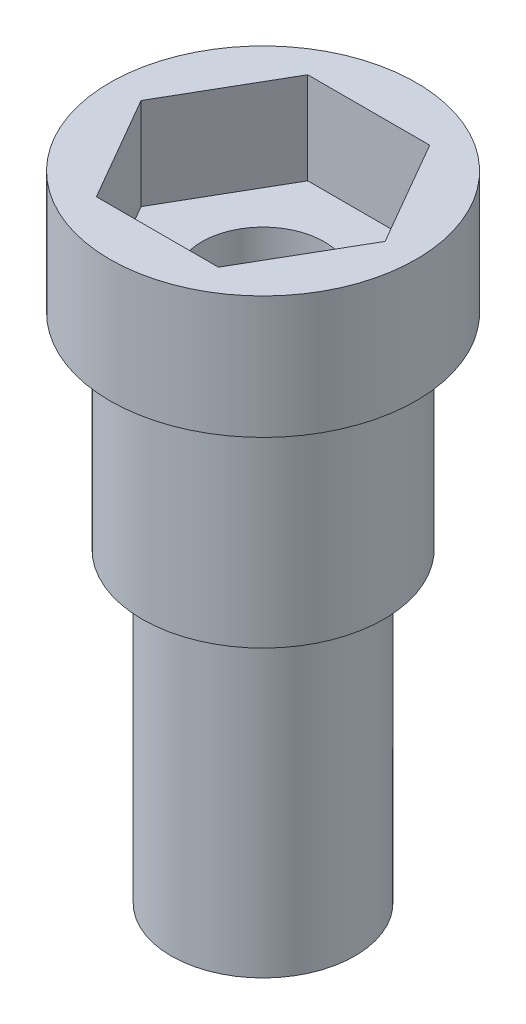
ISO-10303-21;
HEADER;
FILE_DESCRIPTION(('STEP AP214'),'2;1');
FILE_NAME('part.step','',(''),(''),'','','');
FILE_SCHEMA(('AUTOMOTIVE_DESIGN { 1 0 10303 214 1 1 1 1 }'));
ENDSEC;
DATA;
#1=APPLICATION_CONTEXT('core data for automotive mechanical design processes');
#2=APPLICATION_PROTOCOL_DEFINITION('international standard','automotive_design',2000,#1);
#3=PRODUCT_CONTEXT('',#1,'mechanical');
#4=PRODUCT('Part','Part','',(#3));
#5=PRODUCT_RELATED_PRODUCT_CATEGORY('part','',(#4));
#6=PRODUCT_DEFINITION_FORMATION('','',#4);
#7=PRODUCT_DEFINITION_CONTEXT('part definition',#1,'design');
#8=PRODUCT_DEFINITION('design','',#6,#7);
#9=PRODUCT_DEFINITION_SHAPE('','',#8);
#10=(LENGTH_UNIT() NAMED_UNIT(*) SI_UNIT(.MILLI.,.METRE.));
#11=(NAMED_UNIT(*) PLANE_ANGLE_UNIT() SI_UNIT($,.RADIAN.));
#12=(NAMED_UNIT(*) SI_UNIT($,.STERADIAN.) SOLID_ANGLE_UNIT());
#13=UNCERTAINTY_MEASURE_WITH_UNIT(LENGTH_MEASURE(1.E-05),#10,'distance_accuracy_value','');
#14=(GEOMETRIC_REPRESENTATION_CONTEXT(3) GLOBAL_UNCERTAINTY_ASSIGNED_CONTEXT((#13)) GLOBAL_UNIT_ASSIGNED_CONTEXT((#10,
#11,#12)) REPRESENTATION_CONTEXT('',''));
#15=CARTESIAN_POINT('',(0.,0.,0.));
#16=DIRECTION('',(0.,0.,1.));
#17=DIRECTION('',(1.,0.,0.));
#18=AXIS2_PLACEMENT_3D('',#15,#16,#17);
#19=CARTESIAN_POINT('',(0.,18.,0.));
#20=DIRECTION('',(0.,-1.,0.));
#21=DIRECTION('',(0.,0.,-1.));
#22=AXIS2_PLACEMENT_3D('',#19,#20,#21);
#23=CYLINDRICAL_SURFACE('',#22,2.);
#24=CARTESIAN_POINT('',(0.,0.,0.));
#25=DIRECTION('',(0.,1.,0.));
#26=DIRECTION('',(0.,0.,1.));
#27=AXIS2_PLACEMENT_3D('',#24,#25,#26);
#28=CIRCLE('',#27,2.);
#29=CARTESIAN_POINT('',(0.,0.,2.));
#30=VERTEX_POINT('',#29);
#31=EDGE_CURVE('E160',#30,#30,#28,.T.);
#32=ORIENTED_EDGE('',*,*,#31,.F.);
#33=EDGE_LOOP('',(#32));
#34=FACE_BOUND('',#33,.T.);
#35=CARTESIAN_POINT('',(0.,17.7,0.));
#36=DIRECTION('',(0.,1.,0.));
#37=DIRECTION('',(0.,0.,1.));
#38=AXIS2_PLACEMENT_3D('',#35,#36,#37);
#39=CIRCLE('',#38,2.);
#40=CARTESIAN_POINT('',(0.,17.7,2.));
#41=VERTEX_POINT('',#40);
#42=EDGE_CURVE('E45',#41,#41,#39,.T.);
#43=ORIENTED_EDGE('',*,*,#42,.T.);
#44=EDGE_LOOP('',(#43));
#45=FACE_BOUND('',#44,.T.);
#46=ADVANCED_FACE('F41',(#34,#45),#23,.F.);
#47=CARTESIAN_POINT('',(0.,18.,0.));
#48=DIRECTION('',(0.,-1.,0.));
#49=DIRECTION('',(0.,0.,-1.));
#50=AXIS2_PLACEMENT_3D('',#47,#48,#49);
#51=CYLINDRICAL_SURFACE('',#50,3.);
#52=CARTESIAN_POINT('',(0.,0.,0.));
#53=DIRECTION('',(0.,1.,0.));
#54=DIRECTION('',(0.,0.,1.));
#55=AXIS2_PLACEMENT_3D('',#52,#53,#54);
#56=CIRCLE('',#55,3.);
#57=CARTESIAN_POINT('',(0.,0.,3.));
#58=VERTEX_POINT('',#57);
#59=EDGE_CURVE('E50',#58,#58,#56,.T.);
#60=ORIENTED_EDGE('',*,*,#59,.T.);
#61=EDGE_LOOP('',(#60));
#62=FACE_BOUND('',#61,.T.);
#63=CARTESIAN_POINT('',(0.,10.,0.));
#64=DIRECTION('',(0.,1.,0.));
#65=DIRECTION('',(0.,0.,1.));
#66=AXIS2_PLACEMENT_3D('',#63,#64,#65);
#67=CIRCLE('',#66,3.);
#68=CARTESIAN_POINT('',(0.,10.,3.));
#69=VERTEX_POINT('',#68);
#70=EDGE_CURVE('E11',#69,#69,#67,.T.);
#71=ORIENTED_EDGE('',*,*,#70,.F.);
#72=EDGE_LOOP('',(#71));
#73=FACE_BOUND('',#72,.T.);
#74=ADVANCED_FACE('F43',(#62,#73),#51,.T.);
#75=CARTESIAN_POINT('',(0.,0.,0.));
#76=DIRECTION('',(0.,1.,0.));
#77=DIRECTION('',(0.,0.,1.));
#78=AXIS2_PLACEMENT_3D('',#75,#76,#77);
#79=PLANE('',#78);
#80=ORIENTED_EDGE('',*,*,#59,.F.);
#81=EDGE_LOOP('',(#80));
#82=FACE_BOUND('',#81,.T.);
#83=ORIENTED_EDGE('',*,*,#31,.T.);
#84=EDGE_LOOP('',(#83));
#85=FACE_BOUND('',#84,.T.);
#86=ADVANCED_FACE('F169',(#82,#85),#79,.F.);
#87=CARTESIAN_POINT('',(0.,10.,0.));
#88=DIRECTION('',(0.,1.,0.));
#89=DIRECTION('',(0.,0.,1.));
#90=AXIS2_PLACEMENT_3D('',#87,#88,#89);
#91=PLANE('',#90);
#92=CARTESIAN_POINT('',(0.,10.,0.));
#93=DIRECTION('',(0.,1.,0.));
#94=DIRECTION('',(0.,0.,1.));
#95=AXIS2_PLACEMENT_3D('',#92,#93,#94);
#96=CIRCLE('',#95,3.95);
#97=CARTESIAN_POINT('',(0.,10.,3.95));
#98=VERTEX_POINT('',#97);
#99=EDGE_CURVE('E153',#98,#98,#96,.T.);
#100=ORIENTED_EDGE('',*,*,#99,.F.);
#101=EDGE_LOOP('',(#100));
#102=FACE_BOUND('',#101,.T.);
#103=ORIENTED_EDGE('',*,*,#70,.T.);
#104=EDGE_LOOP('',(#103));
#105=FACE_BOUND('',#104,.T.);
#106=ADVANCED_FACE('F172',(#102,#105),#91,.F.);
#107=CARTESIAN_POINT('',(0.,16.7,0.));
#108=DIRECTION('',(0.,-1.,0.));
#109=DIRECTION('',(0.,0.,-1.));
#110=AXIS2_PLACEMENT_3D('',#107,#108,#109);
#111=CYLINDRICAL_SURFACE('',#110,3.95);
#112=CARTESIAN_POINT('',(0.,16.7,0.));
#113=DIRECTION('',(0.,1.,0.));
#114=DIRECTION('',(0.,0.,1.));
#115=AXIS2_PLACEMENT_3D('',#112,#113,#114);
#116=CIRCLE('',#115,3.95);
#117=CARTESIAN_POINT('',(0.,16.7,3.95));
#118=VERTEX_POINT('',#117);
#119=EDGE_CURVE('E157',#118,#118,#116,.T.);
#120=ORIENTED_EDGE('',*,*,#119,.F.);
#121=EDGE_LOOP('',(#120));
#122=FACE_BOUND('',#121,.T.);
#123=ORIENTED_EDGE('',*,*,#99,.T.);
#124=EDGE_LOOP('',(#123));
#125=FACE_BOUND('',#124,.T.);
#126=ADVANCED_FACE('F209',(#122,#125),#111,.T.);
#127=CARTESIAN_POINT('',(0.,20.7,0.));
#128=DIRECTION('',(0.,1.,0.));
#129=DIRECTION('',(0.,0.,1.));
#130=AXIS2_PLACEMENT_3D('',#127,#128,#129);
#131=PLANE('',#130);
#132=DIRECTION('',(0.5,0.,-0.866025403784439));
#133=VECTOR('',#132,1.);
#134=CARTESIAN_POINT('',(1.99185842870421,20.7,3.45));
#135=LINE('',#134,#133);
#136=CARTESIAN_POINT('',(1.99185842870421,20.7,3.45));
#137=VERTEX_POINT('',#136);
#138=CARTESIAN_POINT('',(3.98371685740842,20.7,0.));
#139=VERTEX_POINT('',#138);
#140=EDGE_CURVE('E58',#137,#139,#135,.T.);
#141=ORIENTED_EDGE('',*,*,#140,.F.);
#142=DIRECTION('',(1.,0.,0.));
#143=VECTOR('',#142,1.);
#144=CARTESIAN_POINT('',(-1.99185842870421,20.7,3.45));
#145=LINE('',#144,#143);
#146=CARTESIAN_POINT('',(-1.99185842870421,20.7,3.45));
#147=VERTEX_POINT('',#146);
#148=EDGE_CURVE('E141',#147,#137,#145,.T.);
#149=ORIENTED_EDGE('',*,*,#148,.F.);
#150=DIRECTION('',(0.5,0.,0.866025403784439));
#151=VECTOR('',#150,1.);
#152=CARTESIAN_POINT('',(-3.98371685740842,20.7,0.));
#153=LINE('',#152,#151);
#154=CARTESIAN_POINT('',(-3.98371685740842,20.7,0.));
#155=VERTEX_POINT('',#154);
#156=EDGE_CURVE('E139',#155,#147,#153,.T.);
#157=ORIENTED_EDGE('',*,*,#156,.F.);
#158=DIRECTION('',(-0.5,0.,0.866025403784439));
#159=VECTOR('',#158,1.);
#160=CARTESIAN_POINT('',(-1.99185842870421,20.7,-3.45));
#161=LINE('',#160,#159);
#162=CARTESIAN_POINT('',(-1.99185842870421,20.7,-3.45));
#163=VERTEX_POINT('',#162);
#164=EDGE_CURVE('E106',#163,#155,#161,.T.);
#165=ORIENTED_EDGE('',*,*,#164,.F.);
#166=DIRECTION('',(-1.,0.,0.));
#167=VECTOR('',#166,1.);
#168=CARTESIAN_POINT('',(1.99185842870421,20.7,-3.45));
#169=LINE('',#168,#167);
#170=CARTESIAN_POINT('',(1.99185842870421,20.7,-3.45));
#171=VERTEX_POINT('',#170);
#172=EDGE_CURVE('E135',#171,#163,#169,.T.);
#173=ORIENTED_EDGE('',*,*,#172,.F.);
#174=DIRECTION('',(-0.5,0.,-0.866025403784439));
#175=VECTOR('',#174,1.);
#176=CARTESIAN_POINT('',(3.98371685740842,20.7,0.));
#177=LINE('',#176,#175);
#178=EDGE_CURVE('E132',#139,#171,#177,.T.);
#179=ORIENTED_EDGE('',*,*,#178,.F.);
#180=EDGE_LOOP('',(#141,#149,#157,#165,#173,#179));
#181=FACE_BOUND('',#180,.T.);
#182=CARTESIAN_POINT('',(0.,20.7,0.));
#183=DIRECTION('',(0.,1.,0.));
#184=DIRECTION('',(0.,0.,1.));
#185=AXIS2_PLACEMENT_3D('',#182,#183,#184);
#186=CIRCLE('',#185,5.);
#187=CARTESIAN_POINT('',(0.,20.7,5.));
#188=VERTEX_POINT('',#187);
#189=EDGE_CURVE('E150',#188,#188,#186,.T.);
#190=ORIENTED_EDGE('',*,*,#189,.T.);
#191=EDGE_LOOP('',(#190));
#192=FACE_BOUND('',#191,.T.);
#193=ADVANCED_FACE('F205',(#181,#192),#131,.T.);
#194=CARTESIAN_POINT('',(0.,16.7,0.));
#195=DIRECTION('',(0.,1.,0.));
#196=DIRECTION('',(0.,0.,1.));
#197=AXIS2_PLACEMENT_3D('',#194,#195,#196);
#198=PLANE('',#197);
#199=ORIENTED_EDGE('',*,*,#119,.T.);
#200=EDGE_LOOP('',(#199));
#201=FACE_BOUND('',#200,.T.);
#202=CARTESIAN_POINT('',(0.,16.7,0.));
#203=DIRECTION('',(0.,1.,0.));
#204=DIRECTION('',(0.,0.,1.));
#205=AXIS2_PLACEMENT_3D('',#202,#203,#204);
#206=CIRCLE('',#205,5.);
#207=CARTESIAN_POINT('',(0.,16.7,5.));
#208=VERTEX_POINT('',#207);
#209=EDGE_CURVE('E154',#208,#208,#206,.T.);
#210=ORIENTED_EDGE('',*,*,#209,.F.);
#211=EDGE_LOOP('',(#210));
#212=FACE_BOUND('',#211,.T.);
#213=ADVANCED_FACE('F208',(#201,#212),#198,.F.);
#214=CARTESIAN_POINT('',(0.,20.7,0.));
#215=DIRECTION('',(0.,-1.,0.));
#216=DIRECTION('',(0.,0.,-1.));
#217=AXIS2_PLACEMENT_3D('',#214,#215,#216);
#218=CYLINDRICAL_SURFACE('',#217,5.);
#219=ORIENTED_EDGE('',*,*,#189,.F.);
#220=EDGE_LOOP('',(#219));
#221=FACE_BOUND('',#220,.T.);
#222=ORIENTED_EDGE('',*,*,#209,.T.);
#223=EDGE_LOOP('',(#222));
#224=FACE_BOUND('',#223,.T.);
#225=ADVANCED_FACE('F204',(#221,#224),#218,.T.);
#226=CARTESIAN_POINT('',(1.99185842870421,17.7,3.45));
#227=DIRECTION('',(0.866025403784439,0.,0.5));
#228=DIRECTION('',(0.5,0.,-0.866025403784439));
#229=AXIS2_PLACEMENT_3D('',#226,#227,#228);
#230=PLANE('',#229);
#231=ORIENTED_EDGE('',*,*,#140,.T.);
#232=DIRECTION('',(0.,1.,0.));
#233=VECTOR('',#232,1.);
#234=CARTESIAN_POINT('',(3.98371685740842,17.7,0.));
#235=LINE('',#234,#233);
#236=CARTESIAN_POINT('',(3.98371685740842,17.7,0.));
#237=VERTEX_POINT('',#236);
#238=EDGE_CURVE('E88',#237,#139,#235,.T.);
#239=ORIENTED_EDGE('',*,*,#238,.F.);
#240=DIRECTION('',(0.5,0.,-0.866025403784439));
#241=VECTOR('',#240,1.);
#242=CARTESIAN_POINT('',(1.99185842870421,17.7,3.45));
#243=LINE('',#242,#241);
#244=CARTESIAN_POINT('',(1.99185842870421,17.7,3.45));
#245=VERTEX_POINT('',#244);
#246=EDGE_CURVE('E143',#245,#237,#243,.T.);
#247=ORIENTED_EDGE('',*,*,#246,.F.);
#248=DIRECTION('',(0.,1.,0.));
#249=VECTOR('',#248,1.);
#250=CARTESIAN_POINT('',(1.99185842870421,17.7,3.45));
#251=LINE('',#250,#249);
#252=EDGE_CURVE('E66',#245,#137,#251,.T.);
#253=ORIENTED_EDGE('',*,*,#252,.T.);
#254=EDGE_LOOP('',(#231,#239,#247,#253));
#255=FACE_BOUND('',#254,.T.);
#256=ADVANCED_FACE('F194',(#255),#230,.F.);
#257=CARTESIAN_POINT('',(-1.99185842870421,17.7,3.45));
#258=DIRECTION('',(0.,0.,1.));
#259=DIRECTION('',(1.,0.,0.));
#260=AXIS2_PLACEMENT_3D('',#257,#258,#259);
#261=PLANE('',#260);
#262=ORIENTED_EDGE('',*,*,#148,.T.);
#263=ORIENTED_EDGE('',*,*,#252,.F.);
#264=DIRECTION('',(1.,0.,0.));
#265=VECTOR('',#264,1.);
#266=CARTESIAN_POINT('',(-1.99185842870421,17.7,3.45));
#267=LINE('',#266,#265);
#268=CARTESIAN_POINT('',(-1.99185842870421,17.7,3.45));
#269=VERTEX_POINT('',#268);
#270=EDGE_CURVE('E118',#269,#245,#267,.T.);
#271=ORIENTED_EDGE('',*,*,#270,.F.);
#272=DIRECTION('',(0.,1.,0.));
#273=VECTOR('',#272,1.);
#274=CARTESIAN_POINT('',(-1.99185842870421,17.7,3.45));
#275=LINE('',#274,#273);
#276=EDGE_CURVE('E110',#269,#147,#275,.T.);
#277=ORIENTED_EDGE('',*,*,#276,.T.);
#278=EDGE_LOOP('',(#262,#263,#271,#277));
#279=FACE_BOUND('',#278,.T.);
#280=ADVANCED_FACE('F191',(#279),#261,.F.);
#281=CARTESIAN_POINT('',(-3.98371685740842,17.7,0.));
#282=DIRECTION('',(-0.866025403784439,0.,0.5));
#283=DIRECTION('',(0.5,0.,0.866025403784439));
#284=AXIS2_PLACEMENT_3D('',#281,#282,#283);
#285=PLANE('',#284);
#286=ORIENTED_EDGE('',*,*,#156,.T.);
#287=ORIENTED_EDGE('',*,*,#276,.F.);
#288=DIRECTION('',(0.5,0.,0.866025403784439));
#289=VECTOR('',#288,1.);
#290=CARTESIAN_POINT('',(-3.98371685740842,17.7,0.));
#291=LINE('',#290,#289);
#292=CARTESIAN_POINT('',(-3.98371685740842,17.7,0.));
#293=VERTEX_POINT('',#292);
#294=EDGE_CURVE('E114',#293,#269,#291,.T.);
#295=ORIENTED_EDGE('',*,*,#294,.F.);
#296=DIRECTION('',(0.,1.,0.));
#297=VECTOR('',#296,1.);
#298=CARTESIAN_POINT('',(-3.98371685740842,17.7,0.));
#299=LINE('',#298,#297);
#300=EDGE_CURVE('E99',#293,#155,#299,.T.);
#301=ORIENTED_EDGE('',*,*,#300,.T.);
#302=EDGE_LOOP('',(#286,#287,#295,#301));
#303=FACE_BOUND('',#302,.T.);
#304=ADVANCED_FACE('F115',(#303),#285,.F.);
#305=CARTESIAN_POINT('',(-1.99185842870421,17.7,-3.45));
#306=DIRECTION('',(-0.866025403784439,0.,-0.5));
#307=DIRECTION('',(-0.5,0.,0.866025403784439));
#308=AXIS2_PLACEMENT_3D('',#305,#306,#307);
#309=PLANE('',#308);
#310=ORIENTED_EDGE('',*,*,#164,.T.);
#311=ORIENTED_EDGE('',*,*,#300,.F.);
#312=DIRECTION('',(-0.5,0.,0.866025403784439));
#313=VECTOR('',#312,1.);
#314=CARTESIAN_POINT('',(-1.99185842870421,17.7,-3.45));
#315=LINE('',#314,#313);
#316=CARTESIAN_POINT('',(-1.99185842870421,17.7,-3.45));
#317=VERTEX_POINT('',#316);
#318=EDGE_CURVE('E103',#317,#293,#315,.T.);
#319=ORIENTED_EDGE('',*,*,#318,.F.);
#320=DIRECTION('',(0.,1.,0.));
#321=VECTOR('',#320,1.);
#322=CARTESIAN_POINT('',(-1.99185842870421,17.7,-3.45));
#323=LINE('',#322,#321);
#324=EDGE_CURVE('E111',#317,#163,#323,.T.);
#325=ORIENTED_EDGE('',*,*,#324,.T.);
#326=EDGE_LOOP('',(#310,#311,#319,#325));
#327=FACE_BOUND('',#326,.T.);
#328=ADVANCED_FACE('F101',(#327),#309,.F.);
#329=CARTESIAN_POINT('',(1.99185842870421,17.7,-3.45));
#330=DIRECTION('',(0.,0.,-1.));
#331=DIRECTION('',(-1.,0.,0.));
#332=AXIS2_PLACEMENT_3D('',#329,#330,#331);
#333=PLANE('',#332);
#334=ORIENTED_EDGE('',*,*,#172,.T.);
#335=ORIENTED_EDGE('',*,*,#324,.F.);
#336=DIRECTION('',(-1.,0.,0.));
#337=VECTOR('',#336,1.);
#338=CARTESIAN_POINT('',(1.99185842870421,17.7,-3.45));
#339=LINE('',#338,#337);
#340=CARTESIAN_POINT('',(1.99185842870421,17.7,-3.45));
#341=VERTEX_POINT('',#340);
#342=EDGE_CURVE('E124',#341,#317,#339,.T.);
#343=ORIENTED_EDGE('',*,*,#342,.F.);
#344=DIRECTION('',(0.,1.,0.));
#345=VECTOR('',#344,1.);
#346=CARTESIAN_POINT('',(1.99185842870421,17.7,-3.45));
#347=LINE('',#346,#345);
#348=EDGE_CURVE('E147',#341,#171,#347,.T.);
#349=ORIENTED_EDGE('',*,*,#348,.T.);
#350=EDGE_LOOP('',(#334,#335,#343,#349));
#351=FACE_BOUND('',#350,.T.);
#352=ADVANCED_FACE('F187',(#351),#333,.F.);
#353=CARTESIAN_POINT('',(3.98371685740842,17.7,0.));
#354=DIRECTION('',(0.866025403784439,0.,-0.5));
#355=DIRECTION('',(-0.5,0.,-0.866025403784439));
#356=AXIS2_PLACEMENT_3D('',#353,#354,#355);
#357=PLANE('',#356);
#358=ORIENTED_EDGE('',*,*,#178,.T.);
#359=ORIENTED_EDGE('',*,*,#348,.F.);
#360=DIRECTION('',(-0.5,0.,-0.866025403784439));
#361=VECTOR('',#360,1.);
#362=CARTESIAN_POINT('',(3.98371685740842,17.7,0.));
#363=LINE('',#362,#361);
#364=EDGE_CURVE('E126',#237,#341,#363,.T.);
#365=ORIENTED_EDGE('',*,*,#364,.F.);
#366=ORIENTED_EDGE('',*,*,#238,.T.);
#367=EDGE_LOOP('',(#358,#359,#365,#366));
#368=FACE_BOUND('',#367,.T.);
#369=ADVANCED_FACE('F182',(#368),#357,.F.);
#370=CARTESIAN_POINT('',(0.,17.7,0.));
#371=DIRECTION('',(0.,1.,0.));
#372=DIRECTION('',(0.,0.,1.));
#373=AXIS2_PLACEMENT_3D('',#370,#371,#372);
#374=PLANE('',#373);
#375=ORIENTED_EDGE('',*,*,#42,.F.);
#376=EDGE_LOOP('',(#375));
#377=FACE_BOUND('',#376,.T.);
#378=ORIENTED_EDGE('',*,*,#246,.T.);
#379=ORIENTED_EDGE('',*,*,#364,.T.);
#380=ORIENTED_EDGE('',*,*,#342,.T.);
#381=ORIENTED_EDGE('',*,*,#318,.T.);
#382=ORIENTED_EDGE('',*,*,#294,.T.);
#383=ORIENTED_EDGE('',*,*,#270,.T.);
#384=EDGE_LOOP('',(#378,#379,#380,#381,#382,#383));
#385=FACE_BOUND('',#384,.T.);
#386=ADVANCED_FACE('F121',(#377,#385),#374,.T.);
#387=CLOSED_SHELL('',(#46,#74,#86,#106,#126,#193,#213,#225,#256,#280,#304,#328,#352,#369,#386));
#388=MANIFOLD_SOLID_BREP('B2',#387);
#389=ADVANCED_BREP_SHAPE_REPRESENTATION('',(#18,#388),#14);
#390=SHAPE_DEFINITION_REPRESENTATION(#9,#389);
ENDSEC;
END-ISO-10303-21;
